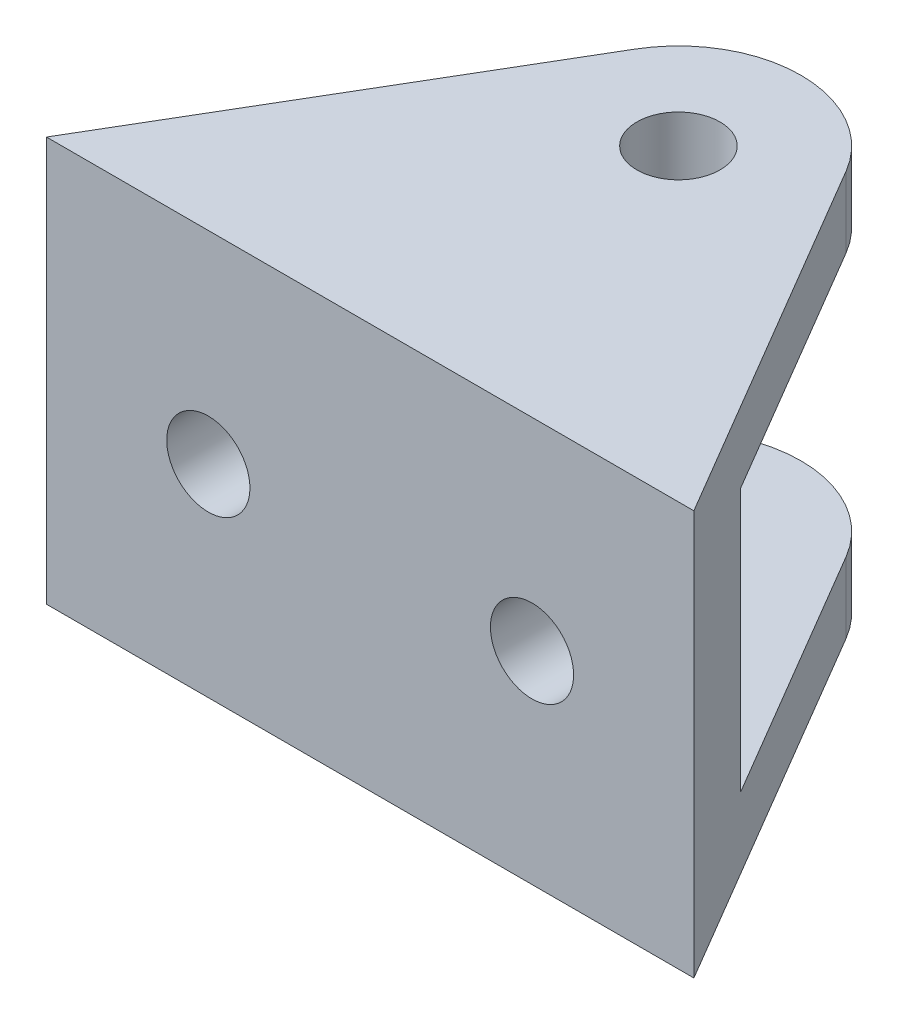
ISO-10303-21;
HEADER;
FILE_DESCRIPTION(('STEP AP214'),'2;1');
FILE_NAME('part.step','',(''),(''),'','','');
FILE_SCHEMA(('AUTOMOTIVE_DESIGN { 1 0 10303 214 1 1 1 1 }'));
ENDSEC;
DATA;
#1=APPLICATION_CONTEXT('core data for automotive mechanical design processes');
#2=APPLICATION_PROTOCOL_DEFINITION('international standard','automotive_design',2000,#1);
#3=PRODUCT_CONTEXT('',#1,'mechanical');
#4=PRODUCT('Part','Part','',(#3));
#5=PRODUCT_RELATED_PRODUCT_CATEGORY('part','',(#4));
#6=PRODUCT_DEFINITION_FORMATION('','',#4);
#7=PRODUCT_DEFINITION_CONTEXT('part definition',#1,'design');
#8=PRODUCT_DEFINITION('design','',#6,#7);
#9=PRODUCT_DEFINITION_SHAPE('','',#8);
#10=(LENGTH_UNIT() NAMED_UNIT(*) SI_UNIT(.MILLI.,.METRE.));
#11=(NAMED_UNIT(*) PLANE_ANGLE_UNIT() SI_UNIT($,.RADIAN.));
#12=(NAMED_UNIT(*) SI_UNIT($,.STERADIAN.) SOLID_ANGLE_UNIT());
#13=UNCERTAINTY_MEASURE_WITH_UNIT(LENGTH_MEASURE(1.E-05),#10,'distance_accuracy_value','');
#14=(GEOMETRIC_REPRESENTATION_CONTEXT(3) GLOBAL_UNCERTAINTY_ASSIGNED_CONTEXT((#13)) GLOBAL_UNIT_ASSIGNED_CONTEXT((#10,
#11,#12)) REPRESENTATION_CONTEXT('',''));
#15=CARTESIAN_POINT('',(0.,0.,0.));
#16=DIRECTION('',(0.,0.,1.));
#17=DIRECTION('',(1.,0.,0.));
#18=AXIS2_PLACEMENT_3D('',#15,#16,#17);
#19=CARTESIAN_POINT('',(50.8,0.,-43.2880611098928));
#20=DIRECTION('',(0.,1.,0.));
#21=DIRECTION('',(0.,0.,1.));
#22=AXIS2_PLACEMENT_3D('',#19,#20,#21);
#23=PLANE('',#22);
#24=CARTESIAN_POINT('',(25.4,0.,-24.188970367598));
#25=DIRECTION('',(0.,-1.,0.));
#26=DIRECTION('',(0.,0.,-1.));
#27=AXIS2_PLACEMENT_3D('',#24,#25,#26);
#28=CIRCLE('',#27,3.2639);
#29=CARTESIAN_POINT('',(25.4,0.,-27.452870367598));
#30=VERTEX_POINT('',#29);
#31=EDGE_CURVE('E141',#30,#30,#28,.T.);
#32=ORIENTED_EDGE('',*,*,#31,.F.);
#33=EDGE_LOOP('',(#32));
#34=FACE_BOUND('',#33,.T.);
#35=CARTESIAN_POINT('',(25.4,0.,-24.188970367598));
#36=DIRECTION('',(0.,1.,0.));
#37=DIRECTION('',(0.,0.,-1.));
#38=AXIS2_PLACEMENT_3D('',#35,#36,#37);
#39=CIRCLE('',#38,9.6139);
#40=CARTESIAN_POINT('',(33.6843903218753,0.,-29.0670796534605));
#41=VERTEX_POINT('',#40);
#42=CARTESIAN_POINT('',(17.1156096781247,0.,-29.0670796534605));
#43=VERTEX_POINT('',#42);
#44=EDGE_CURVE('E146',#41,#43,#39,.T.);
#45=ORIENTED_EDGE('',*,*,#44,.F.);
#46=DIRECTION('',(-0.507401708553505,0.,-0.861709641443673));
#47=VECTOR('',#46,1.);
#48=CARTESIAN_POINT('',(33.6843903218753,0.,-29.0670796534605));
#49=LINE('',#48,#47);
#50=CARTESIAN_POINT('',(50.8,0.,0.));
#51=VERTEX_POINT('',#50);
#52=EDGE_CURVE('E248',#51,#41,#49,.T.);
#53=ORIENTED_EDGE('',*,*,#52,.F.);
#54=DIRECTION('',(-1.,0.,0.));
#55=VECTOR('',#54,1.);
#56=CARTESIAN_POINT('',(50.8,0.,0.));
#57=LINE('',#56,#55);
#58=CARTESIAN_POINT('',(0.,0.,0.));
#59=VERTEX_POINT('',#58);
#60=EDGE_CURVE('E223',#51,#59,#57,.T.);
#61=ORIENTED_EDGE('',*,*,#60,.T.);
#62=DIRECTION('',(-0.507401708553505,0.,0.861709641443673));
#63=VECTOR('',#62,1.);
#64=CARTESIAN_POINT('',(17.1156096781247,0.,-29.0670796534605));
#65=LINE('',#64,#63);
#66=EDGE_CURVE('E69',#43,#59,#65,.T.);
#67=ORIENTED_EDGE('',*,*,#66,.F.);
#68=EDGE_LOOP('',(#45,#53,#61,#67));
#69=FACE_BOUND('',#68,.T.);
#70=ADVANCED_FACE('F47',(#34,#69),#23,.F.);
#71=CARTESIAN_POINT('',(50.8,5.5499,-8.89));
#72=DIRECTION('',(0.,-1.,0.));
#73=DIRECTION('',(0.,0.,-1.));
#74=AXIS2_PLACEMENT_3D('',#71,#72,#73);
#75=PLANE('',#74);
#76=CARTESIAN_POINT('',(25.4,5.5499,-24.188970367598));
#77=DIRECTION('',(0.,-1.,0.));
#78=DIRECTION('',(0.,0.,-1.));
#79=AXIS2_PLACEMENT_3D('',#76,#77,#78);
#80=CIRCLE('',#79,3.2639);
#81=CARTESIAN_POINT('',(25.4,5.54990000000001,-27.452870367598));
#82=VERTEX_POINT('',#81);
#83=EDGE_CURVE('E176',#82,#82,#80,.T.);
#84=ORIENTED_EDGE('',*,*,#83,.T.);
#85=EDGE_LOOP('',(#84));
#86=FACE_BOUND('',#85,.T.);
#87=DIRECTION('',(-1.,0.,0.));
#88=VECTOR('',#87,1.);
#89=CARTESIAN_POINT('',(50.8,5.5499,-8.89));
#90=LINE('',#89,#88);
#91=CARTESIAN_POINT('',(45.5652887096825,5.5499,-8.89));
#92=VERTEX_POINT('',#91);
#93=CARTESIAN_POINT('',(5.23471129031752,5.5499,-8.89));
#94=VERTEX_POINT('',#93);
#95=EDGE_CURVE('E11',#92,#94,#90,.T.);
#96=ORIENTED_EDGE('',*,*,#95,.F.);
#97=DIRECTION('',(-0.507401708553505,0.,-0.861709641443673));
#98=VECTOR('',#97,1.);
#99=CARTESIAN_POINT('',(46.9129991247681,5.5499,-6.60121176973559));
#100=LINE('',#99,#98);
#101=CARTESIAN_POINT('',(33.6843903218753,5.54990000000002,-29.0670796534605));
#102=VERTEX_POINT('',#101);
#103=EDGE_CURVE('E168',#92,#102,#100,.T.);
#104=ORIENTED_EDGE('',*,*,#103,.T.);
#105=CARTESIAN_POINT('',(25.4,5.5499,-24.188970367598));
#106=DIRECTION('',(0.,-1.,0.));
#107=DIRECTION('',(0.,0.,-1.));
#108=AXIS2_PLACEMENT_3D('',#105,#106,#107);
#109=CIRCLE('',#108,9.6139);
#110=CARTESIAN_POINT('',(17.1156096781247,5.54990000000002,-29.0670796534605));
#111=VERTEX_POINT('',#110);
#112=EDGE_CURVE('E183',#102,#111,#109,.F.);
#113=ORIENTED_EDGE('',*,*,#112,.T.);
#114=DIRECTION('',(-0.507401708553505,0.,0.861709641443673));
#115=VECTOR('',#114,1.);
#116=CARTESIAN_POINT('',(16.9657907624571,5.5499,-28.8126453424894));
#117=LINE('',#116,#115);
#118=EDGE_CURVE('E158',#111,#94,#117,.T.);
#119=ORIENTED_EDGE('',*,*,#118,.T.);
#120=EDGE_LOOP('',(#96,#104,#113,#119));
#121=FACE_BOUND('',#120,.T.);
#122=ADVANCED_FACE('F241',(#86,#121),#75,.F.);
#123=CARTESIAN_POINT('',(50.8,26.2001,-8.89));
#124=DIRECTION('',(0.,0.,1.));
#125=DIRECTION('',(0.,-1.,0.));
#126=AXIS2_PLACEMENT_3D('',#123,#124,#125);
#127=PLANE('',#126);
#128=CARTESIAN_POINT('',(38.1,15.875,-8.89));
#129=DIRECTION('',(0.,0.,-1.));
#130=DIRECTION('',(0.,1.,0.));
#131=AXIS2_PLACEMENT_3D('',#128,#129,#130);
#132=CIRCLE('',#131,7.14374999999999);
#133=CARTESIAN_POINT('',(38.1,23.01875,-8.89));
#134=VERTEX_POINT('',#133);
#135=EDGE_CURVE('E187',#134,#134,#132,.T.);
#136=ORIENTED_EDGE('',*,*,#135,.F.);
#137=EDGE_LOOP('',(#136));
#138=FACE_BOUND('',#137,.T.);
#139=CARTESIAN_POINT('',(12.7,15.875,-8.89));
#140=DIRECTION('',(0.,0.,-1.));
#141=DIRECTION('',(0.,1.,0.));
#142=AXIS2_PLACEMENT_3D('',#139,#140,#141);
#143=CIRCLE('',#142,7.14374999999999);
#144=CARTESIAN_POINT('',(12.7,23.01875,-8.89));
#145=VERTEX_POINT('',#144);
#146=EDGE_CURVE('E203',#145,#145,#143,.T.);
#147=ORIENTED_EDGE('',*,*,#146,.F.);
#148=EDGE_LOOP('',(#147));
#149=FACE_BOUND('',#148,.T.);
#150=DIRECTION('',(-1.,0.,0.));
#151=VECTOR('',#150,1.);
#152=CARTESIAN_POINT('',(50.8,26.2001,-8.89));
#153=LINE('',#152,#151);
#154=CARTESIAN_POINT('',(45.5652887096825,26.2001,-8.89));
#155=VERTEX_POINT('',#154);
#156=CARTESIAN_POINT('',(5.23471129031751,26.2001,-8.89));
#157=VERTEX_POINT('',#156);
#158=EDGE_CURVE('E55',#155,#157,#153,.T.);
#159=ORIENTED_EDGE('',*,*,#158,.F.);
#160=DIRECTION('',(0.,-1.,0.));
#161=VECTOR('',#160,1.);
#162=CARTESIAN_POINT('',(45.5652887096825,26.2001,-8.89));
#163=LINE('',#162,#161);
#164=EDGE_CURVE('E164',#155,#92,#163,.T.);
#165=ORIENTED_EDGE('',*,*,#164,.T.);
#166=ORIENTED_EDGE('',*,*,#95,.T.);
#167=DIRECTION('',(0.,1.,0.));
#168=VECTOR('',#167,1.);
#169=CARTESIAN_POINT('',(5.23471129031752,26.2001,-8.89));
#170=LINE('',#169,#168);
#171=EDGE_CURVE('E154',#94,#157,#170,.T.);
#172=ORIENTED_EDGE('',*,*,#171,.T.);
#173=EDGE_LOOP('',(#159,#165,#166,#172));
#174=FACE_BOUND('',#173,.T.);
#175=ADVANCED_FACE('F236',(#138,#149,#174),#127,.F.);
#176=CARTESIAN_POINT('',(50.8,26.2001,-43.2880611098928));
#177=DIRECTION('',(0.,1.,0.));
#178=DIRECTION('',(0.,0.,1.));
#179=AXIS2_PLACEMENT_3D('',#176,#177,#178);
#180=PLANE('',#179);
#181=CARTESIAN_POINT('',(25.4,26.2001,-24.188970367598));
#182=DIRECTION('',(0.,1.,0.));
#183=DIRECTION('',(0.,0.,1.));
#184=AXIS2_PLACEMENT_3D('',#181,#182,#183);
#185=CIRCLE('',#184,3.2639);
#186=CARTESIAN_POINT('',(25.4,26.2001,-27.452870367598));
#187=VERTEX_POINT('',#186);
#188=EDGE_CURVE('E172',#187,#187,#185,.T.);
#189=ORIENTED_EDGE('',*,*,#188,.T.);
#190=EDGE_LOOP('',(#189));
#191=FACE_BOUND('',#190,.T.);
#192=CARTESIAN_POINT('',(25.4,26.2001,-24.188970367598));
#193=DIRECTION('',(0.,1.,0.));
#194=DIRECTION('',(0.,0.,1.));
#195=AXIS2_PLACEMENT_3D('',#192,#193,#194);
#196=CIRCLE('',#195,9.6139);
#197=CARTESIAN_POINT('',(17.1156096781247,26.2001,-29.0670796534605));
#198=VERTEX_POINT('',#197);
#199=CARTESIAN_POINT('',(33.6843903218753,26.2001,-29.0670796534605));
#200=VERTEX_POINT('',#199);
#201=EDGE_CURVE('E180',#198,#200,#196,.F.);
#202=ORIENTED_EDGE('',*,*,#201,.T.);
#203=DIRECTION('',(0.507401708553505,0.,0.861709641443673));
#204=VECTOR('',#203,1.);
#205=CARTESIAN_POINT('',(31.8730335859115,26.2001,-32.1432686712776));
#206=LINE('',#205,#204);
#207=EDGE_CURVE('E127',#200,#155,#206,.T.);
#208=ORIENTED_EDGE('',*,*,#207,.T.);
#209=ORIENTED_EDGE('',*,*,#158,.T.);
#210=DIRECTION('',(0.507401708553505,0.,-0.861709641443673));
#211=VECTOR('',#210,1.);
#212=CARTESIAN_POINT('',(32.0057563013137,26.2001,-54.3547022440314));
#213=LINE('',#212,#211);
#214=EDGE_CURVE('E150',#157,#198,#213,.T.);
#215=ORIENTED_EDGE('',*,*,#214,.T.);
#216=EDGE_LOOP('',(#202,#208,#209,#215));
#217=FACE_BOUND('',#216,.T.);
#218=ADVANCED_FACE('F234',(#191,#217),#180,.F.);
#219=CARTESIAN_POINT('',(50.8,31.75,0.));
#220=DIRECTION('',(0.,-1.,0.));
#221=DIRECTION('',(0.,0.,-1.));
#222=AXIS2_PLACEMENT_3D('',#219,#220,#221);
#223=PLANE('',#222);
#224=CARTESIAN_POINT('',(25.4,31.75,-24.188970367598));
#225=DIRECTION('',(0.,-1.,0.));
#226=DIRECTION('',(0.,0.,-1.));
#227=AXIS2_PLACEMENT_3D('',#224,#225,#226);
#228=CIRCLE('',#227,3.2639);
#229=CARTESIAN_POINT('',(25.4,31.75,-27.452870367598));
#230=VERTEX_POINT('',#229);
#231=EDGE_CURVE('E145',#230,#230,#228,.F.);
#232=ORIENTED_EDGE('',*,*,#231,.F.);
#233=EDGE_LOOP('',(#232));
#234=FACE_BOUND('',#233,.T.);
#235=DIRECTION('',(-1.,0.,0.));
#236=VECTOR('',#235,1.);
#237=CARTESIAN_POINT('',(50.8,31.75,0.));
#238=LINE('',#237,#236);
#239=CARTESIAN_POINT('',(50.8,31.75,0.));
#240=VERTEX_POINT('',#239);
#241=CARTESIAN_POINT('',(0.,31.75,0.));
#242=VERTEX_POINT('',#241);
#243=EDGE_CURVE('E134',#240,#242,#238,.T.);
#244=ORIENTED_EDGE('',*,*,#243,.F.);
#245=DIRECTION('',(0.507401708553505,0.,0.861709641443673));
#246=VECTOR('',#245,1.);
#247=CARTESIAN_POINT('',(33.6843903218753,31.75,-29.0670796534605));
#248=LINE('',#247,#246);
#249=CARTESIAN_POINT('',(33.6843903218753,31.75,-29.0670796534605));
#250=VERTEX_POINT('',#249);
#251=EDGE_CURVE('E120',#250,#240,#248,.T.);
#252=ORIENTED_EDGE('',*,*,#251,.F.);
#253=CARTESIAN_POINT('',(25.4,31.75,-24.188970367598));
#254=DIRECTION('',(0.,-1.,0.));
#255=DIRECTION('',(0.,0.,-1.));
#256=AXIS2_PLACEMENT_3D('',#253,#254,#255);
#257=CIRCLE('',#256,9.6139);
#258=CARTESIAN_POINT('',(17.1156096781247,31.75,-29.0670796534605));
#259=VERTEX_POINT('',#258);
#260=EDGE_CURVE('E111',#259,#250,#257,.T.);
#261=ORIENTED_EDGE('',*,*,#260,.F.);
#262=DIRECTION('',(0.507401708553505,0.,-0.861709641443673));
#263=VECTOR('',#262,1.);
#264=CARTESIAN_POINT('',(17.1156096781247,31.75,-29.0670796534605));
#265=LINE('',#264,#263);
#266=EDGE_CURVE('E121',#242,#259,#265,.T.);
#267=ORIENTED_EDGE('',*,*,#266,.F.);
#268=EDGE_LOOP('',(#244,#252,#261,#267));
#269=FACE_BOUND('',#268,.T.);
#270=ADVANCED_FACE('F132',(#234,#269),#223,.F.);
#271=CARTESIAN_POINT('',(50.8,0.,0.));
#272=DIRECTION('',(0.,0.,-1.));
#273=DIRECTION('',(-1.,0.,0.));
#274=AXIS2_PLACEMENT_3D('',#271,#272,#273);
#275=PLANE('',#274);
#276=CARTESIAN_POINT('',(38.1,15.875,0.));
#277=DIRECTION('',(0.,0.,-1.));
#278=DIRECTION('',(0.,1.,0.));
#279=AXIS2_PLACEMENT_3D('',#276,#277,#278);
#280=CIRCLE('',#279,3.2639);
#281=CARTESIAN_POINT('',(38.1,19.1389,0.));
#282=VERTEX_POINT('',#281);
#283=EDGE_CURVE('E199',#282,#282,#280,.T.);
#284=ORIENTED_EDGE('',*,*,#283,.T.);
#285=EDGE_LOOP('',(#284));
#286=FACE_BOUND('',#285,.T.);
#287=CARTESIAN_POINT('',(12.7,15.875,0.));
#288=DIRECTION('',(0.,0.,-1.));
#289=DIRECTION('',(0.,1.,0.));
#290=AXIS2_PLACEMENT_3D('',#287,#288,#289);
#291=CIRCLE('',#290,3.2639);
#292=CARTESIAN_POINT('',(12.7,19.1389,0.));
#293=VERTEX_POINT('',#292);
#294=EDGE_CURVE('E215',#293,#293,#291,.T.);
#295=ORIENTED_EDGE('',*,*,#294,.T.);
#296=EDGE_LOOP('',(#295));
#297=FACE_BOUND('',#296,.T.);
#298=DIRECTION('',(0.,-1.,0.));
#299=VECTOR('',#298,1.);
#300=CARTESIAN_POINT('',(0.,0.,0.));
#301=LINE('',#300,#299);
#302=EDGE_CURVE('E219',#242,#59,#301,.T.);
#303=ORIENTED_EDGE('',*,*,#302,.T.);
#304=ORIENTED_EDGE('',*,*,#60,.F.);
#305=DIRECTION('',(0.,-1.,0.));
#306=VECTOR('',#305,1.);
#307=CARTESIAN_POINT('',(50.8,0.,0.));
#308=LINE('',#307,#306);
#309=EDGE_CURVE('E220',#240,#51,#308,.T.);
#310=ORIENTED_EDGE('',*,*,#309,.F.);
#311=ORIENTED_EDGE('',*,*,#243,.T.);
#312=EDGE_LOOP('',(#303,#304,#310,#311));
#313=FACE_BOUND('',#312,.T.);
#314=ADVANCED_FACE('F262',(#286,#297,#313),#275,.F.);
#315=CARTESIAN_POINT('',(12.7,15.875,-8.89));
#316=DIRECTION('',(0.,0.,-1.));
#317=DIRECTION('',(0.,1.,0.));
#318=AXIS2_PLACEMENT_3D('',#315,#316,#317);
#319=CYLINDRICAL_SURFACE('',#318,3.2639);
#320=ORIENTED_EDGE('',*,*,#294,.F.);
#321=EDGE_LOOP('',(#320));
#322=FACE_BOUND('',#321,.T.);
#323=CARTESIAN_POINT('',(12.7,15.875,-4.826));
#324=DIRECTION('',(0.,0.,-1.));
#325=DIRECTION('',(0.,1.,0.));
#326=AXIS2_PLACEMENT_3D('',#323,#324,#325);
#327=CIRCLE('',#326,3.2639);
#328=CARTESIAN_POINT('',(12.7,19.1389,-4.826));
#329=VERTEX_POINT('',#328);
#330=EDGE_CURVE('E211',#329,#329,#327,.T.);
#331=ORIENTED_EDGE('',*,*,#330,.T.);
#332=EDGE_LOOP('',(#331));
#333=FACE_BOUND('',#332,.T.);
#334=ADVANCED_FACE('F264',(#322,#333),#319,.F.);
#335=CARTESIAN_POINT('',(15.9639,15.875,-4.826));
#336=DIRECTION('',(0.,0.,1.));
#337=DIRECTION('',(0.,-1.,0.));
#338=AXIS2_PLACEMENT_3D('',#335,#336,#337);
#339=PLANE('',#338);
#340=ORIENTED_EDGE('',*,*,#330,.F.);
#341=EDGE_LOOP('',(#340));
#342=FACE_BOUND('',#341,.T.);
#343=CARTESIAN_POINT('',(12.7,15.875,-4.826));
#344=DIRECTION('',(0.,0.,-1.));
#345=DIRECTION('',(0.,1.,0.));
#346=AXIS2_PLACEMENT_3D('',#343,#344,#345);
#347=CIRCLE('',#346,7.14375);
#348=CARTESIAN_POINT('',(12.7,23.01875,-4.826));
#349=VERTEX_POINT('',#348);
#350=EDGE_CURVE('E207',#349,#349,#347,.T.);
#351=ORIENTED_EDGE('',*,*,#350,.T.);
#352=EDGE_LOOP('',(#351));
#353=FACE_BOUND('',#352,.T.);
#354=ADVANCED_FACE('F272',(#342,#353),#339,.F.);
#355=CARTESIAN_POINT('',(12.7,15.875,-8.89));
#356=DIRECTION('',(0.,0.,-1.));
#357=DIRECTION('',(0.,1.,0.));
#358=AXIS2_PLACEMENT_3D('',#355,#356,#357);
#359=CYLINDRICAL_SURFACE('',#358,7.14375);
#360=ORIENTED_EDGE('',*,*,#350,.F.);
#361=EDGE_LOOP('',(#360));
#362=FACE_BOUND('',#361,.T.);
#363=ORIENTED_EDGE('',*,*,#146,.T.);
#364=EDGE_LOOP('',(#363));
#365=FACE_BOUND('',#364,.T.);
#366=ADVANCED_FACE('F310',(#362,#365),#359,.F.);
#367=CARTESIAN_POINT('',(38.1,15.875,-8.89));
#368=DIRECTION('',(0.,0.,-1.));
#369=DIRECTION('',(0.,1.,0.));
#370=AXIS2_PLACEMENT_3D('',#367,#368,#369);
#371=CYLINDRICAL_SURFACE('',#370,3.2639);
#372=ORIENTED_EDGE('',*,*,#283,.F.);
#373=EDGE_LOOP('',(#372));
#374=FACE_BOUND('',#373,.T.);
#375=CARTESIAN_POINT('',(38.1,15.875,-4.826));
#376=DIRECTION('',(0.,0.,-1.));
#377=DIRECTION('',(0.,1.,0.));
#378=AXIS2_PLACEMENT_3D('',#375,#376,#377);
#379=CIRCLE('',#378,3.2639);
#380=CARTESIAN_POINT('',(38.1,19.1389,-4.826));
#381=VERTEX_POINT('',#380);
#382=EDGE_CURVE('E195',#381,#381,#379,.T.);
#383=ORIENTED_EDGE('',*,*,#382,.T.);
#384=EDGE_LOOP('',(#383));
#385=FACE_BOUND('',#384,.T.);
#386=ADVANCED_FACE('F306',(#374,#385),#371,.F.);
#387=CARTESIAN_POINT('',(41.3639,15.875,-4.826));
#388=DIRECTION('',(0.,0.,1.));
#389=DIRECTION('',(0.,-1.,0.));
#390=AXIS2_PLACEMENT_3D('',#387,#388,#389);
#391=PLANE('',#390);
#392=ORIENTED_EDGE('',*,*,#382,.F.);
#393=EDGE_LOOP('',(#392));
#394=FACE_BOUND('',#393,.T.);
#395=CARTESIAN_POINT('',(38.1,15.875,-4.826));
#396=DIRECTION('',(0.,0.,-1.));
#397=DIRECTION('',(0.,1.,0.));
#398=AXIS2_PLACEMENT_3D('',#395,#396,#397);
#399=CIRCLE('',#398,7.14375);
#400=CARTESIAN_POINT('',(38.1,23.01875,-4.826));
#401=VERTEX_POINT('',#400);
#402=EDGE_CURVE('E191',#401,#401,#399,.T.);
#403=ORIENTED_EDGE('',*,*,#402,.T.);
#404=EDGE_LOOP('',(#403));
#405=FACE_BOUND('',#404,.T.);
#406=ADVANCED_FACE('F302',(#394,#405),#391,.F.);
#407=CARTESIAN_POINT('',(38.1,15.875,-8.89));
#408=DIRECTION('',(0.,0.,-1.));
#409=DIRECTION('',(0.,1.,0.));
#410=AXIS2_PLACEMENT_3D('',#407,#408,#409);
#411=CYLINDRICAL_SURFACE('',#410,7.14374999999999);
#412=ORIENTED_EDGE('',*,*,#402,.F.);
#413=EDGE_LOOP('',(#412));
#414=FACE_BOUND('',#413,.T.);
#415=ORIENTED_EDGE('',*,*,#135,.T.);
#416=EDGE_LOOP('',(#415));
#417=FACE_BOUND('',#416,.T.);
#418=ADVANCED_FACE('F300',(#414,#417),#411,.F.);
#419=CARTESIAN_POINT('',(25.4,98.4920125157596,-24.188970367598));
#420=DIRECTION('',(0.,-1.,0.));
#421=DIRECTION('',(0.,0.,-1.));
#422=AXIS2_PLACEMENT_3D('',#419,#420,#421);
#423=CYLINDRICAL_SURFACE('',#422,9.6139);
#424=DIRECTION('',(0.,-1.,0.));
#425=VECTOR('',#424,1.);
#426=CARTESIAN_POINT('',(33.6843903218753,98.4920125157596,-29.0670796534605));
#427=LINE('',#426,#425);
#428=EDGE_CURVE('E130',#102,#41,#427,.T.);
#429=ORIENTED_EDGE('',*,*,#428,.T.);
#430=ORIENTED_EDGE('',*,*,#44,.T.);
#431=DIRECTION('',(0.,-1.,0.));
#432=VECTOR('',#431,1.);
#433=CARTESIAN_POINT('',(17.1156096781247,98.4920125157596,-29.0670796534605));
#434=LINE('',#433,#432);
#435=EDGE_CURVE('E129',#111,#43,#434,.T.);
#436=ORIENTED_EDGE('',*,*,#435,.F.);
#437=ORIENTED_EDGE('',*,*,#112,.F.);
#438=EDGE_LOOP('',(#429,#430,#436,#437));
#439=FACE_BOUND('',#438,.T.);
#440=ADVANCED_FACE('F244',(#439),#423,.T.);
#441=EDGE_CURVE('E62',#259,#198,#434,.T.);
#442=ORIENTED_EDGE('',*,*,#441,.F.);
#443=ORIENTED_EDGE('',*,*,#260,.T.);
#444=EDGE_CURVE('E114',#250,#200,#427,.T.);
#445=ORIENTED_EDGE('',*,*,#444,.T.);
#446=ORIENTED_EDGE('',*,*,#201,.F.);
#447=EDGE_LOOP('',(#442,#443,#445,#446));
#448=FACE_BOUND('',#447,.T.);
#449=ADVANCED_FACE('F113',(#448),#423,.T.);
#450=CARTESIAN_POINT('',(33.6843903218753,98.4920125157596,-29.0670796534605));
#451=DIRECTION('',(-0.861709641443673,0.,0.507401708553505));
#452=DIRECTION('',(0.507401708553505,0.,0.861709641443673));
#453=AXIS2_PLACEMENT_3D('',#450,#451,#452);
#454=PLANE('',#453);
#455=ORIENTED_EDGE('',*,*,#164,.F.);
#456=ORIENTED_EDGE('',*,*,#207,.F.);
#457=ORIENTED_EDGE('',*,*,#444,.F.);
#458=ORIENTED_EDGE('',*,*,#251,.T.);
#459=ORIENTED_EDGE('',*,*,#309,.T.);
#460=ORIENTED_EDGE('',*,*,#52,.T.);
#461=ORIENTED_EDGE('',*,*,#428,.F.);
#462=ORIENTED_EDGE('',*,*,#103,.F.);
#463=EDGE_LOOP('',(#455,#456,#457,#458,#459,#460,#461,#462));
#464=FACE_BOUND('',#463,.T.);
#465=ADVANCED_FACE('F124',(#464),#454,.F.);
#466=CARTESIAN_POINT('',(17.1156096781247,98.4920125157596,-29.0670796534605));
#467=DIRECTION('',(0.861709641443673,0.,0.507401708553505));
#468=DIRECTION('',(0.507401708553505,0.,-0.861709641443673));
#469=AXIS2_PLACEMENT_3D('',#466,#467,#468);
#470=PLANE('',#469);
#471=ORIENTED_EDGE('',*,*,#435,.T.);
#472=ORIENTED_EDGE('',*,*,#66,.T.);
#473=ORIENTED_EDGE('',*,*,#302,.F.);
#474=ORIENTED_EDGE('',*,*,#266,.T.);
#475=ORIENTED_EDGE('',*,*,#441,.T.);
#476=ORIENTED_EDGE('',*,*,#214,.F.);
#477=ORIENTED_EDGE('',*,*,#171,.F.);
#478=ORIENTED_EDGE('',*,*,#118,.F.);
#479=EDGE_LOOP('',(#471,#472,#473,#474,#475,#476,#477,#478));
#480=FACE_BOUND('',#479,.T.);
#481=ADVANCED_FACE('F238',(#480),#470,.F.);
#482=CARTESIAN_POINT('',(25.4,98.4920125157596,-24.188970367598));
#483=DIRECTION('',(0.,-1.,0.));
#484=DIRECTION('',(0.,0.,-1.));
#485=AXIS2_PLACEMENT_3D('',#482,#483,#484);
#486=CYLINDRICAL_SURFACE('',#485,3.2639);
#487=CARTESIAN_POINT('',(25.4,31.75,-27.452870367598));
#488=CARTESIAN_POINT('',(25.4,31.6921885416667,-27.452870367598));
#489=CARTESIAN_POINT('',(25.4,31.6343770833333,-27.452870367598));
#490=CARTESIAN_POINT('',(25.4,31.5187541666667,-27.452870367598));
#491=CARTESIAN_POINT('',(25.4,31.4609427083333,-27.452870367598));
#492=CARTESIAN_POINT('',(25.4,31.3453197916667,-27.452870367598));
#493=CARTESIAN_POINT('',(25.4,31.2875083333333,-27.452870367598));
#494=CARTESIAN_POINT('',(25.4,31.1718854166667,-27.452870367598));
#495=CARTESIAN_POINT('',(25.4,31.1140739583333,-27.452870367598));
#496=CARTESIAN_POINT('',(25.4,30.9984510416667,-27.452870367598));
#497=CARTESIAN_POINT('',(25.4,30.9406395833333,-27.452870367598));
#498=CARTESIAN_POINT('',(25.4,30.8250166666667,-27.452870367598));
#499=CARTESIAN_POINT('',(25.4,30.7672052083333,-27.452870367598));
#500=CARTESIAN_POINT('',(25.4,30.6515822916667,-27.452870367598));
#501=CARTESIAN_POINT('',(25.4,30.5937708333333,-27.452870367598));
#502=CARTESIAN_POINT('',(25.4,30.4781479166667,-27.452870367598));
#503=CARTESIAN_POINT('',(25.4,30.4203364583333,-27.452870367598));
#504=CARTESIAN_POINT('',(25.4,30.3047135416667,-27.452870367598));
#505=CARTESIAN_POINT('',(25.4,30.2469020833333,-27.452870367598));
#506=CARTESIAN_POINT('',(25.4,30.1312791666667,-27.452870367598));
#507=CARTESIAN_POINT('',(25.4,30.0734677083333,-27.452870367598));
#508=CARTESIAN_POINT('',(25.4,29.9578447916667,-27.452870367598));
#509=CARTESIAN_POINT('',(25.4,29.9000333333333,-27.452870367598));
#510=CARTESIAN_POINT('',(25.4,29.7844104166667,-27.452870367598));
#511=CARTESIAN_POINT('',(25.4,29.7265989583333,-27.452870367598));
#512=CARTESIAN_POINT('',(25.4,29.6109760416667,-27.452870367598));
#513=CARTESIAN_POINT('',(25.4,29.5531645833333,-27.452870367598));
#514=CARTESIAN_POINT('',(25.4,29.4375416666667,-27.452870367598));
#515=CARTESIAN_POINT('',(25.4,29.3797302083333,-27.452870367598));
#516=CARTESIAN_POINT('',(25.4,29.2641072916667,-27.452870367598));
#517=CARTESIAN_POINT('',(25.4,29.2062958333333,-27.452870367598));
#518=CARTESIAN_POINT('',(25.4,29.0906729166667,-27.452870367598));
#519=CARTESIAN_POINT('',(25.4,29.0328614583333,-27.452870367598));
#520=CARTESIAN_POINT('',(25.4,28.9172385416667,-27.452870367598));
#521=CARTESIAN_POINT('',(25.4,28.8594270833333,-27.452870367598));
#522=CARTESIAN_POINT('',(25.4,28.7438041666667,-27.452870367598));
#523=CARTESIAN_POINT('',(25.4,28.6859927083333,-27.452870367598));
#524=CARTESIAN_POINT('',(25.4,28.5703697916667,-27.452870367598));
#525=CARTESIAN_POINT('',(25.4,28.5125583333333,-27.452870367598));
#526=CARTESIAN_POINT('',(25.4,28.3969354166667,-27.452870367598));
#527=CARTESIAN_POINT('',(25.4,28.3391239583333,-27.452870367598));
#528=CARTESIAN_POINT('',(25.4,28.2235010416667,-27.452870367598));
#529=CARTESIAN_POINT('',(25.4,28.1656895833333,-27.452870367598));
#530=CARTESIAN_POINT('',(25.4,28.0500666666667,-27.452870367598));
#531=CARTESIAN_POINT('',(25.4,27.9922552083333,-27.452870367598));
#532=CARTESIAN_POINT('',(25.4,27.8766322916667,-27.452870367598));
#533=CARTESIAN_POINT('',(25.4,27.8188208333333,-27.452870367598));
#534=CARTESIAN_POINT('',(25.4,27.7031979166667,-27.452870367598));
#535=CARTESIAN_POINT('',(25.4,27.6453864583333,-27.452870367598));
#536=CARTESIAN_POINT('',(25.4,27.5297635416667,-27.452870367598));
#537=CARTESIAN_POINT('',(25.4,27.4719520833333,-27.452870367598));
#538=CARTESIAN_POINT('',(25.4,27.3563291666667,-27.452870367598));
#539=CARTESIAN_POINT('',(25.4,27.2985177083333,-27.452870367598));
#540=CARTESIAN_POINT('',(25.4,27.1828947916667,-27.452870367598));
#541=CARTESIAN_POINT('',(25.4,27.1250833333333,-27.452870367598));
#542=CARTESIAN_POINT('',(25.4,27.0094604166667,-27.452870367598));
#543=CARTESIAN_POINT('',(25.4,26.9516489583333,-27.452870367598));
#544=CARTESIAN_POINT('',(25.4,26.8360260416667,-27.452870367598));
#545=CARTESIAN_POINT('',(25.4,26.7782145833333,-27.452870367598));
#546=CARTESIAN_POINT('',(25.4,26.6625916666667,-27.452870367598));
#547=CARTESIAN_POINT('',(25.4,26.6047802083333,-27.452870367598));
#548=CARTESIAN_POINT('',(25.4,26.4891572916667,-27.452870367598));
#549=CARTESIAN_POINT('',(25.4,26.4313458333333,-27.452870367598));
#550=CARTESIAN_POINT('',(25.4,26.3157229166667,-27.452870367598));
#551=CARTESIAN_POINT('',(25.4,26.2579114583333,-27.452870367598));
#552=CARTESIAN_POINT('',(25.4,26.2001,-27.452870367598));
#553=B_SPLINE_CURVE_WITH_KNOTS('',3,(#487,#488,#489,#490,#491,#492,#493,#494,#495,#496,#497,
#498,#499,#500,#501,#502,#503,#504,#505,#506,#507,#508,#509,#510,#511,#512,#513,#514,#515,#516,
#517,#518,#519,#520,#521,#522,#523,#524,#525,#526,#527,#528,#529,#530,#531,#532,#533,#534,#535,
#536,#537,#538,#539,#540,#541,#542,#543,#544,#545,#546,#547,#548,#549,#550,#551,#552),
.UNSPECIFIED.,.F.,.F.,(4,2,2,2,2,2,2,2,2,2,2,2,2,2,2,2,2,2,2,2,2,2,2,2,2,2,2,2,2,2,2,2,4),(0.,
0.173434375000003,0.346868750000007,0.520303124999996,0.6937375,0.867171875000003,
1.04060625000001,1.21404062500001,1.387475,1.560909375,1.73434375000001,1.90777812500001,
2.08121250000001,2.25464687500002,2.42808125000001,2.60151562500001,2.77495000000001,
2.94838437500002,3.12181875000002,3.29525312500001,3.46868750000001,3.64212187500002,
3.81555625000002,3.98899062500002,4.16242500000003,4.33585937500001,4.50929375000002,
4.68272812500002,4.85616250000002,5.02959687500003,5.20303125000002,5.37646562500002,
5.54990000000002),.UNSPECIFIED.);
#554=EDGE_CURVE('BSEAM290',#230,#187,#553,.T.);
#555=ORIENTED_EDGE('',*,*,#231,.T.);
#556=ORIENTED_EDGE('',*,*,#188,.F.);
#557=ORIENTED_EDGE('',*,*,#554,.T.);
#558=ORIENTED_EDGE('',*,*,#554,.F.);
#559=EDGE_LOOP('',(#555,#557,#556,#558));
#560=FACE_BOUND('',#559,.T.);
#561=ADVANCED_FACE('F290',(#560),#486,.F.);
#562=CARTESIAN_POINT('',(25.4,0.,-27.452870367598));
#563=CARTESIAN_POINT('',(25.4,0.0578114583333483,-27.452870367598));
#564=CARTESIAN_POINT('',(25.4,0.115622916666683,-27.452870367598));
#565=CARTESIAN_POINT('',(25.4,0.231245833333352,-27.452870367598));
#566=CARTESIAN_POINT('',(25.4,0.289057291666686,-27.452870367598));
#567=CARTESIAN_POINT('',(25.4,0.40468020833335,-27.452870367598));
#568=CARTESIAN_POINT('',(25.4,0.46249166666668,-27.452870367598));
#569=CARTESIAN_POINT('',(25.4,0.578114583333345,-27.452870367598));
#570=CARTESIAN_POINT('',(25.4,0.635926041666679,-27.452870367598));
#571=CARTESIAN_POINT('',(25.4,0.751548958333348,-27.452870367598));
#572=CARTESIAN_POINT('',(25.4,0.809360416666682,-27.452870367598));
#573=CARTESIAN_POINT('',(25.4,0.924983333333347,-27.452870367598));
#574=CARTESIAN_POINT('',(25.4,0.982794791666676,-27.452870367598));
#575=CARTESIAN_POINT('',(25.4,1.09841770833334,-27.452870367598));
#576=CARTESIAN_POINT('',(25.4,1.15622916666668,-27.452870367598));
#577=CARTESIAN_POINT('',(25.4,1.27185208333334,-27.452870367598));
#578=CARTESIAN_POINT('',(25.4,1.32966354166668,-27.452870367598));
#579=CARTESIAN_POINT('',(25.4,1.44528645833335,-27.452870367598));
#580=CARTESIAN_POINT('',(25.4,1.50309791666668,-27.452870367598));
#581=CARTESIAN_POINT('',(25.4,1.61872083333335,-27.452870367598));
#582=CARTESIAN_POINT('',(25.4,1.67653229166669,-27.452870367598));
#583=CARTESIAN_POINT('',(25.4,1.79215520833335,-27.452870367598));
#584=CARTESIAN_POINT('',(25.4,1.84996666666668,-27.452870367598));
#585=CARTESIAN_POINT('',(25.4,1.96558958333334,-27.452870367598));
#586=CARTESIAN_POINT('',(25.4,2.02340104166668,-27.452870367598));
#587=CARTESIAN_POINT('',(25.4,2.13902395833335,-27.452870367598));
#588=CARTESIAN_POINT('',(25.4,2.19683541666668,-27.452870367598));
#589=CARTESIAN_POINT('',(25.4,2.31245833333335,-27.452870367598));
#590=CARTESIAN_POINT('',(25.4,2.37026979166668,-27.452870367598));
#591=CARTESIAN_POINT('',(25.4,2.48589270833334,-27.452870367598));
#592=CARTESIAN_POINT('',(25.4,2.54370416666667,-27.452870367598));
#593=CARTESIAN_POINT('',(25.4,2.65932708333334,-27.452870367598));
#594=CARTESIAN_POINT('',(25.4,2.71713854166668,-27.452870367598));
#595=CARTESIAN_POINT('',(25.4,2.83276145833335,-27.452870367598));
#596=CARTESIAN_POINT('',(25.4,2.89057291666668,-27.452870367598));
#597=CARTESIAN_POINT('',(25.4,3.00619583333335,-27.452870367598));
#598=CARTESIAN_POINT('',(25.4,3.06400729166668,-27.452870367598));
#599=CARTESIAN_POINT('',(25.4,3.17963020833335,-27.452870367598));
#600=CARTESIAN_POINT('',(25.4,3.23744166666668,-27.452870367598));
#601=CARTESIAN_POINT('',(25.4,3.35306458333334,-27.452870367598));
#602=CARTESIAN_POINT('',(25.4,3.41087604166668,-27.452870367598));
#603=CARTESIAN_POINT('',(25.4,3.52649895833335,-27.452870367598));
#604=CARTESIAN_POINT('',(25.4,3.58431041666668,-27.452870367598));
#605=CARTESIAN_POINT('',(25.4,3.69993333333334,-27.452870367598));
#606=CARTESIAN_POINT('',(25.4,3.75774479166667,-27.452870367598));
#607=CARTESIAN_POINT('',(25.4,3.87336770833334,-27.452870367598));
#608=CARTESIAN_POINT('',(25.4,3.93117916666667,-27.452870367598));
#609=CARTESIAN_POINT('',(25.4,4.04680208333334,-27.452870367598));
#610=CARTESIAN_POINT('',(25.4,4.10461354166668,-27.452870367598));
#611=CARTESIAN_POINT('',(25.4,4.22023645833335,-27.452870367598));
#612=CARTESIAN_POINT('',(25.4,4.27804791666668,-27.452870367598));
#613=CARTESIAN_POINT('',(25.4,4.39367083333335,-27.452870367598));
#614=CARTESIAN_POINT('',(25.4,4.45148229166668,-27.452870367598));
#615=CARTESIAN_POINT('',(25.4,4.56710520833335,-27.452870367598));
#616=CARTESIAN_POINT('',(25.4,4.62491666666668,-27.452870367598));
#617=CARTESIAN_POINT('',(25.4,4.74053958333334,-27.452870367598));
#618=CARTESIAN_POINT('',(25.4,4.79835104166668,-27.452870367598));
#619=CARTESIAN_POINT('',(25.4,4.91397395833335,-27.452870367598));
#620=CARTESIAN_POINT('',(25.4,4.97178541666668,-27.452870367598));
#621=CARTESIAN_POINT('',(25.4,5.08740833333334,-27.452870367598));
#622=CARTESIAN_POINT('',(25.4,5.14521979166667,-27.452870367598));
#623=CARTESIAN_POINT('',(25.4,5.26084270833334,-27.452870367598));
#624=CARTESIAN_POINT('',(25.4,5.31865416666667,-27.452870367598));
#625=CARTESIAN_POINT('',(25.4,5.43427708333334,-27.452870367598));
#626=CARTESIAN_POINT('',(25.4,5.49208854166668,-27.452870367598));
#627=CARTESIAN_POINT('',(25.4,5.54990000000001,-27.452870367598));
#628=B_SPLINE_CURVE_WITH_KNOTS('',3,(#562,#563,#564,#565,#566,#567,#568,#569,#570,#571,#572,
#573,#574,#575,#576,#577,#578,#579,#580,#581,#582,#583,#584,#585,#586,#587,#588,#589,#590,#591,
#592,#593,#594,#595,#596,#597,#598,#599,#600,#601,#602,#603,#604,#605,#606,#607,#608,#609,#610,
#611,#612,#613,#614,#615,#616,#617,#618,#619,#620,#621,#622,#623,#624,#625,#626,#627),
.UNSPECIFIED.,.F.,.F.,(4,2,2,2,2,2,2,2,2,2,2,2,2,2,2,2,2,2,2,2,2,2,2,2,2,2,2,2,2,2,2,2,4),(0.,
0.173434375000003,0.346868750000007,0.520303124999996,0.6937375,0.867171875000003,
1.04060624999999,1.214040625,1.387475,1.560909375,1.73434375000001,1.907778125,2.0812125,
2.254646875,2.42808124999999,2.60151562499999,2.77495,2.948384375,3.12181875,3.29525312499999,
3.4686875,3.642121875,3.81555624999999,3.98899062499999,4.162425,4.335859375,4.50929375,
4.68272812499999,4.8561625,5.029596875,5.20303124999999,5.37646562499999,5.5499),.UNSPECIFIED.);
#629=EDGE_CURVE('BSEAM287',#30,#82,#628,.T.);
#630=ORIENTED_EDGE('',*,*,#31,.T.);
#631=ORIENTED_EDGE('',*,*,#83,.F.);
#632=ORIENTED_EDGE('',*,*,#629,.T.);
#633=ORIENTED_EDGE('',*,*,#629,.F.);
#634=EDGE_LOOP('',(#630,#632,#631,#633));
#635=FACE_BOUND('',#634,.T.);
#636=ADVANCED_FACE('F287',(#635),#486,.F.);
#637=CLOSED_SHELL('',(#70,#122,#175,#218,#270,#314,#334,#354,#366,#386,#406,#418,#440,#449,#465,
#481,#561,#636));
#638=MANIFOLD_SOLID_BREP('B2',#637);
#639=ADVANCED_BREP_SHAPE_REPRESENTATION('',(#18,#638),#14);
#640=SHAPE_DEFINITION_REPRESENTATION(#9,#639);
ENDSEC;
END-ISO-10303-21;
